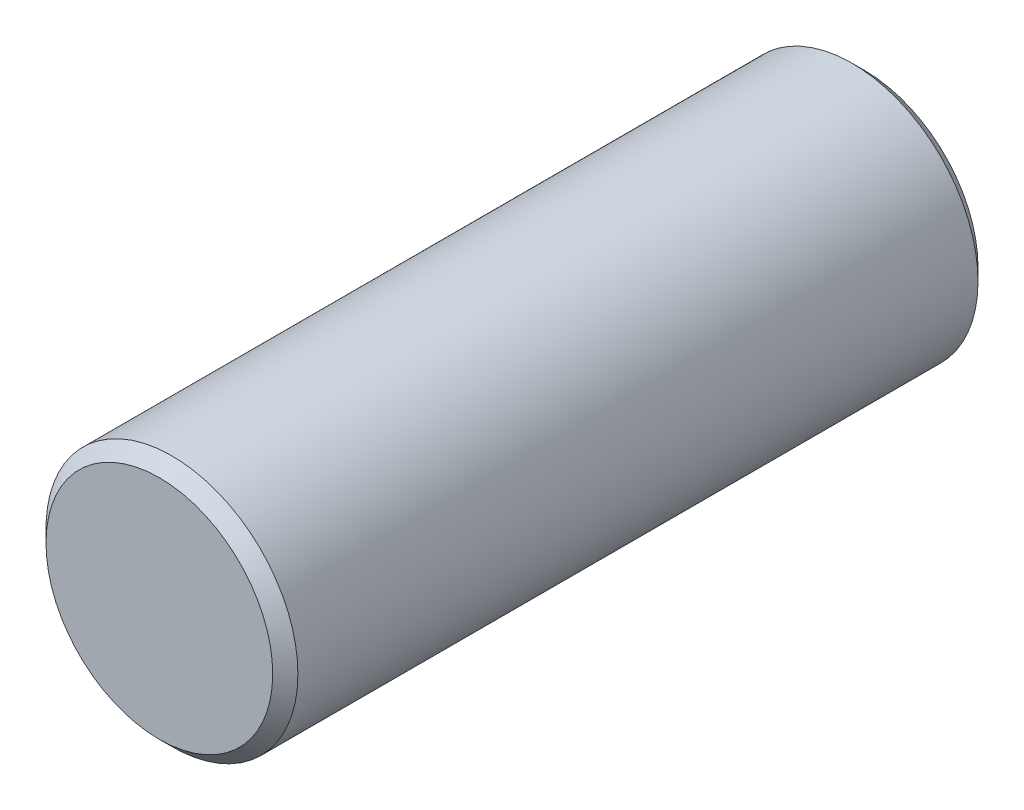
ISO-10303-21;
HEADER;
FILE_DESCRIPTION(('STEP AP214'),'2;1');
FILE_NAME('part.step','',(''),(''),'','','');
FILE_SCHEMA(('AUTOMOTIVE_DESIGN { 1 0 10303 214 1 1 1 1 }'));
ENDSEC;
DATA;
#1=APPLICATION_CONTEXT('core data for automotive mechanical design processes');
#2=APPLICATION_PROTOCOL_DEFINITION('international standard','automotive_design',2000,#1);
#3=PRODUCT_CONTEXT('',#1,'mechanical');
#4=PRODUCT('Part','Part','',(#3));
#5=PRODUCT_RELATED_PRODUCT_CATEGORY('part','',(#4));
#6=PRODUCT_DEFINITION_FORMATION('','',#4);
#7=PRODUCT_DEFINITION_CONTEXT('part definition',#1,'design');
#8=PRODUCT_DEFINITION('design','',#6,#7);
#9=PRODUCT_DEFINITION_SHAPE('','',#8);
#10=(LENGTH_UNIT() NAMED_UNIT(*) SI_UNIT(.MILLI.,.METRE.));
#11=(NAMED_UNIT(*) PLANE_ANGLE_UNIT() SI_UNIT($,.RADIAN.));
#12=(NAMED_UNIT(*) SI_UNIT($,.STERADIAN.) SOLID_ANGLE_UNIT());
#13=UNCERTAINTY_MEASURE_WITH_UNIT(LENGTH_MEASURE(1.E-05),#10,'distance_accuracy_value','');
#14=(GEOMETRIC_REPRESENTATION_CONTEXT(3) GLOBAL_UNCERTAINTY_ASSIGNED_CONTEXT((#13)) GLOBAL_UNIT_ASSIGNED_CONTEXT((#10,
#11,#12)) REPRESENTATION_CONTEXT('',''));
#15=CARTESIAN_POINT('',(0.,0.,0.));
#16=DIRECTION('',(0.,0.,1.));
#17=DIRECTION('',(1.,0.,0.));
#18=AXIS2_PLACEMENT_3D('',#15,#16,#17);
#19=CARTESIAN_POINT('',(0.,0.,28.));
#20=DIRECTION('',(0.,0.,-1.));
#21=DIRECTION('',(-1.,0.,0.));
#22=AXIS2_PLACEMENT_3D('',#19,#20,#21);
#23=CYLINDRICAL_SURFACE('',#22,5.);
#24=CARTESIAN_POINT('',(0.,0.,27.5));
#25=DIRECTION('',(0.,0.,1.));
#26=DIRECTION('',(1.,0.,0.));
#27=AXIS2_PLACEMENT_3D('',#24,#25,#26);
#28=CIRCLE('',#27,5.);
#29=CARTESIAN_POINT('',(5.,0.,27.5));
#30=VERTEX_POINT('',#29);
#31=EDGE_CURVE('E37',#30,#30,#28,.F.);
#32=ORIENTED_EDGE('',*,*,#31,.T.);
#33=EDGE_LOOP('',(#32));
#34=FACE_BOUND('',#33,.T.);
#35=CARTESIAN_POINT('',(0.,0.,0.500000000000007));
#36=DIRECTION('',(0.,0.,1.));
#37=DIRECTION('',(1.,0.,0.));
#38=AXIS2_PLACEMENT_3D('',#35,#36,#37);
#39=CIRCLE('',#38,5.);
#40=CARTESIAN_POINT('',(5.,0.,0.500000000000007));
#41=VERTEX_POINT('',#40);
#42=EDGE_CURVE('E41',#41,#41,#39,.T.);
#43=ORIENTED_EDGE('',*,*,#42,.T.);
#44=EDGE_LOOP('',(#43));
#45=FACE_BOUND('',#44,.T.);
#46=ADVANCED_FACE('F31',(#34,#45),#23,.T.);
#47=CARTESIAN_POINT('',(0.,0.,28.));
#48=DIRECTION('',(0.,0.,1.));
#49=DIRECTION('',(1.,0.,0.));
#50=AXIS2_PLACEMENT_3D('',#47,#48,#49);
#51=PLANE('',#50);
#52=CARTESIAN_POINT('',(0.,0.,28.));
#53=DIRECTION('',(0.,0.,1.));
#54=DIRECTION('',(1.,0.,0.));
#55=AXIS2_PLACEMENT_3D('',#52,#53,#54);
#56=CIRCLE('',#55,4.5);
#57=CARTESIAN_POINT('',(4.5,0.,28.));
#58=VERTEX_POINT('',#57);
#59=EDGE_CURVE('E45',#58,#58,#56,.T.);
#60=ORIENTED_EDGE('',*,*,#59,.T.);
#61=EDGE_LOOP('',(#60));
#62=FACE_BOUND('',#61,.T.);
#63=ADVANCED_FACE('F51',(#62),#51,.T.);
#64=CARTESIAN_POINT('',(0.,0.,0.));
#65=DIRECTION('',(0.,0.,1.));
#66=DIRECTION('',(1.,0.,0.));
#67=AXIS2_PLACEMENT_3D('',#64,#65,#66);
#68=PLANE('',#67);
#69=CARTESIAN_POINT('',(0.,0.,0.));
#70=DIRECTION('',(0.,0.,1.));
#71=DIRECTION('',(1.,0.,0.));
#72=AXIS2_PLACEMENT_3D('',#69,#70,#71);
#73=CIRCLE('',#72,4.5);
#74=CARTESIAN_POINT('',(4.5,0.,0.));
#75=VERTEX_POINT('',#74);
#76=EDGE_CURVE('E10',#75,#75,#73,.F.);
#77=ORIENTED_EDGE('',*,*,#76,.T.);
#78=EDGE_LOOP('',(#77));
#79=FACE_BOUND('',#78,.T.);
#80=ADVANCED_FACE('F56',(#79),#68,.F.);
#81=CARTESIAN_POINT('',(0.,0.,28.));
#82=DIRECTION('',(0.,0.,-1.));
#83=DIRECTION('',(-1.,0.,0.));
#84=AXIS2_PLACEMENT_3D('',#81,#82,#83);
#85=CONICAL_SURFACE('',#84,4.5,0.785398163397445);
#86=ORIENTED_EDGE('',*,*,#31,.F.);
#87=EDGE_LOOP('',(#86));
#88=FACE_BOUND('',#87,.T.);
#89=ORIENTED_EDGE('',*,*,#59,.F.);
#90=EDGE_LOOP('',(#89));
#91=FACE_BOUND('',#90,.T.);
#92=ADVANCED_FACE('F53',(#88,#91),#85,.T.);
#93=CARTESIAN_POINT('',(0.,0.,0.500000000000007));
#94=DIRECTION('',(0.,0.,1.));
#95=DIRECTION('',(1.,0.,0.));
#96=AXIS2_PLACEMENT_3D('',#93,#94,#95);
#97=CONICAL_SURFACE('',#96,5.,0.785398163397445);
#98=ORIENTED_EDGE('',*,*,#76,.F.);
#99=EDGE_LOOP('',(#98));
#100=FACE_BOUND('',#99,.T.);
#101=ORIENTED_EDGE('',*,*,#42,.F.);
#102=EDGE_LOOP('',(#101));
#103=FACE_BOUND('',#102,.T.);
#104=ADVANCED_FACE('F55',(#100,#103),#97,.T.);
#105=CLOSED_SHELL('',(#46,#63,#80,#92,#104));
#106=MANIFOLD_SOLID_BREP('B2',#105);
#107=ADVANCED_BREP_SHAPE_REPRESENTATION('',(#18,#106),#14);
#108=SHAPE_DEFINITION_REPRESENTATION(#9,#107);
ENDSEC;
END-ISO-10303-21;
